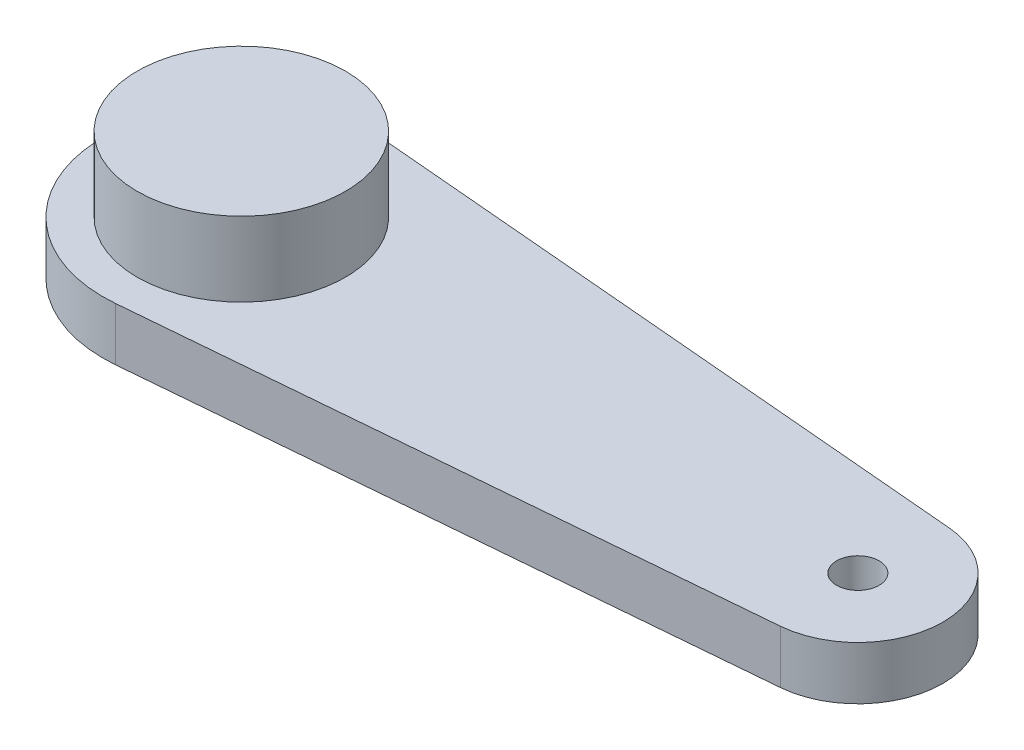
ISO-10303-21;
HEADER;
FILE_DESCRIPTION(('STEP AP214'),'2;1');
FILE_NAME('part.step','',(''),(''),'','','');
FILE_SCHEMA(('AUTOMOTIVE_DESIGN { 1 0 10303 214 1 1 1 1 }'));
ENDSEC;
DATA;
#1=APPLICATION_CONTEXT('core data for automotive mechanical design processes');
#2=APPLICATION_PROTOCOL_DEFINITION('international standard','automotive_design',2000,#1);
#3=PRODUCT_CONTEXT('',#1,'mechanical');
#4=PRODUCT('Part','Part','',(#3));
#5=PRODUCT_RELATED_PRODUCT_CATEGORY('part','',(#4));
#6=PRODUCT_DEFINITION_FORMATION('','',#4);
#7=PRODUCT_DEFINITION_CONTEXT('part definition',#1,'design');
#8=PRODUCT_DEFINITION('design','',#6,#7);
#9=PRODUCT_DEFINITION_SHAPE('','',#8);
#10=(LENGTH_UNIT() NAMED_UNIT(*) SI_UNIT(.MILLI.,.METRE.));
#11=(NAMED_UNIT(*) PLANE_ANGLE_UNIT() SI_UNIT($,.RADIAN.));
#12=(NAMED_UNIT(*) SI_UNIT($,.STERADIAN.) SOLID_ANGLE_UNIT());
#13=UNCERTAINTY_MEASURE_WITH_UNIT(LENGTH_MEASURE(1.E-05),#10,'distance_accuracy_value','');
#14=(GEOMETRIC_REPRESENTATION_CONTEXT(3) GLOBAL_UNCERTAINTY_ASSIGNED_CONTEXT((#13)) GLOBAL_UNIT_ASSIGNED_CONTEXT((#10,
#11,#12)) REPRESENTATION_CONTEXT('',''));
#15=CARTESIAN_POINT('',(0.,0.,0.));
#16=DIRECTION('',(0.,0.,1.));
#17=DIRECTION('',(1.,0.,0.));
#18=AXIS2_PLACEMENT_3D('',#15,#16,#17);
#19=CARTESIAN_POINT('',(0.,2.5,0.));
#20=DIRECTION('',(0.,1.,0.));
#21=DIRECTION('',(0.,0.,1.));
#22=AXIS2_PLACEMENT_3D('',#19,#20,#21);
#23=PLANE('',#22);
#24=CARTESIAN_POINT('',(0.,2.5,0.));
#25=DIRECTION('',(0.,1.,0.));
#26=DIRECTION('',(0.,0.,1.));
#27=AXIS2_PLACEMENT_3D('',#24,#25,#26);
#28=CIRCLE('',#27,4.9);
#29=CARTESIAN_POINT('',(0.,2.5,4.9));
#30=VERTEX_POINT('',#29);
#31=EDGE_CURVE('E11',#30,#30,#28,.T.);
#32=ORIENTED_EDGE('',*,*,#31,.F.);
#33=EDGE_LOOP('',(#32));
#34=FACE_BOUND('',#33,.T.);
#35=CARTESIAN_POINT('',(0.,2.5,0.));
#36=DIRECTION('',(0.,1.,0.));
#37=DIRECTION('',(0.,0.,1.));
#38=AXIS2_PLACEMENT_3D('',#35,#36,#37);
#39=CIRCLE('',#38,6.5);
#40=CARTESIAN_POINT('',(0.560344827586206,2.5,-6.47580216453509));
#41=VERTEX_POINT('',#40);
#42=CARTESIAN_POINT('',(0.560344827586207,2.5,6.47580216453509));
#43=VERTEX_POINT('',#42);
#44=EDGE_CURVE('E91',#41,#43,#39,.T.);
#45=ORIENTED_EDGE('',*,*,#44,.T.);
#46=DIRECTION('',(0.996277256082322,0.,-0.0862068965517241));
#47=VECTOR('',#46,1.);
#48=CARTESIAN_POINT('',(0.560344827586207,2.5,6.47580216453509));
#49=LINE('',#48,#47);
#50=CARTESIAN_POINT('',(29.3448275862069,2.5,3.98510902432929));
#51=VERTEX_POINT('',#50);
#52=EDGE_CURVE('E86',#43,#51,#49,.T.);
#53=ORIENTED_EDGE('',*,*,#52,.T.);
#54=CARTESIAN_POINT('',(29.,2.5,0.));
#55=DIRECTION('',(0.,1.,0.));
#56=DIRECTION('',(0.,0.,1.));
#57=AXIS2_PLACEMENT_3D('',#54,#55,#56);
#58=CIRCLE('',#57,4.);
#59=CARTESIAN_POINT('',(29.3448275862069,2.5,-3.98510902432929));
#60=VERTEX_POINT('',#59);
#61=EDGE_CURVE('E89',#51,#60,#58,.T.);
#62=ORIENTED_EDGE('',*,*,#61,.T.);
#63=DIRECTION('',(-0.996277256082322,0.,-0.086206896551724));
#64=VECTOR('',#63,1.);
#65=CARTESIAN_POINT('',(0.560344827586206,2.5,-6.47580216453509));
#66=LINE('',#65,#64);
#67=EDGE_CURVE('E55',#60,#41,#66,.T.);
#68=ORIENTED_EDGE('',*,*,#67,.T.);
#69=EDGE_LOOP('',(#45,#53,#62,#68));
#70=FACE_BOUND('',#69,.T.);
#71=CARTESIAN_POINT('',(29.,2.5,0.));
#72=DIRECTION('',(0.,1.,0.));
#73=DIRECTION('',(0.,0.,1.));
#74=AXIS2_PLACEMENT_3D('',#71,#72,#73);
#75=CIRCLE('',#74,1.);
#76=CARTESIAN_POINT('',(29.,2.5,1.));
#77=VERTEX_POINT('',#76);
#78=EDGE_CURVE('E107',#77,#77,#75,.T.);
#79=ORIENTED_EDGE('',*,*,#78,.F.);
#80=EDGE_LOOP('',(#79));
#81=FACE_BOUND('',#80,.T.);
#82=ADVANCED_FACE('F37',(#34,#70,#81),#23,.T.);
#83=CARTESIAN_POINT('',(0.,0.,0.));
#84=DIRECTION('',(0.,1.,0.));
#85=DIRECTION('',(0.,0.,1.));
#86=AXIS2_PLACEMENT_3D('',#83,#84,#85);
#87=PLANE('',#86);
#88=CARTESIAN_POINT('',(0.,0.,0.));
#89=DIRECTION('',(0.,1.,0.));
#90=DIRECTION('',(0.,0.,1.));
#91=AXIS2_PLACEMENT_3D('',#88,#89,#90);
#92=CIRCLE('',#91,6.5);
#93=CARTESIAN_POINT('',(0.560344827586206,0.,-6.47580216453509));
#94=VERTEX_POINT('',#93);
#95=CARTESIAN_POINT('',(0.560344827586207,0.,6.47580216453509));
#96=VERTEX_POINT('',#95);
#97=EDGE_CURVE('E104',#94,#96,#92,.T.);
#98=ORIENTED_EDGE('',*,*,#97,.F.);
#99=DIRECTION('',(-0.996277256082322,0.,-0.086206896551724));
#100=VECTOR('',#99,1.);
#101=CARTESIAN_POINT('',(0.560344827586206,0.,-6.47580216453509));
#102=LINE('',#101,#100);
#103=CARTESIAN_POINT('',(29.3448275862069,0.,-3.98510902432929));
#104=VERTEX_POINT('',#103);
#105=EDGE_CURVE('E78',#104,#94,#102,.T.);
#106=ORIENTED_EDGE('',*,*,#105,.F.);
#107=CARTESIAN_POINT('',(29.,0.,0.));
#108=DIRECTION('',(0.,1.,0.));
#109=DIRECTION('',(0.,0.,1.));
#110=AXIS2_PLACEMENT_3D('',#107,#108,#109);
#111=CIRCLE('',#110,4.);
#112=CARTESIAN_POINT('',(29.3448275862069,0.,3.98510902432929));
#113=VERTEX_POINT('',#112);
#114=EDGE_CURVE('E72',#113,#104,#111,.T.);
#115=ORIENTED_EDGE('',*,*,#114,.F.);
#116=DIRECTION('',(0.996277256082322,0.,-0.0862068965517241));
#117=VECTOR('',#116,1.);
#118=CARTESIAN_POINT('',(0.560344827586207,0.,6.47580216453509));
#119=LINE('',#118,#117);
#120=EDGE_CURVE('E96',#96,#113,#119,.T.);
#121=ORIENTED_EDGE('',*,*,#120,.F.);
#122=EDGE_LOOP('',(#98,#106,#115,#121));
#123=FACE_BOUND('',#122,.T.);
#124=CARTESIAN_POINT('',(29.,0.,0.));
#125=DIRECTION('',(0.,1.,0.));
#126=DIRECTION('',(0.,0.,1.));
#127=AXIS2_PLACEMENT_3D('',#124,#125,#126);
#128=CIRCLE('',#127,1.);
#129=CARTESIAN_POINT('',(29.,0.,1.));
#130=VERTEX_POINT('',#129);
#131=EDGE_CURVE('E119',#130,#130,#128,.T.);
#132=ORIENTED_EDGE('',*,*,#131,.T.);
#133=EDGE_LOOP('',(#132));
#134=FACE_BOUND('',#133,.T.);
#135=ADVANCED_FACE('F115',(#123,#134),#87,.F.);
#136=CARTESIAN_POINT('',(0.,2.5,0.));
#137=DIRECTION('',(0.,-1.,0.));
#138=DIRECTION('',(0.,0.,-1.));
#139=AXIS2_PLACEMENT_3D('',#136,#137,#138);
#140=CYLINDRICAL_SURFACE('',#139,6.5);
#141=ORIENTED_EDGE('',*,*,#97,.T.);
#142=DIRECTION('',(0.,-1.,0.));
#143=VECTOR('',#142,1.);
#144=CARTESIAN_POINT('',(0.560344827586207,2.5,6.47580216453509));
#145=LINE('',#144,#143);
#146=EDGE_CURVE('E41',#43,#96,#145,.T.);
#147=ORIENTED_EDGE('',*,*,#146,.F.);
#148=ORIENTED_EDGE('',*,*,#44,.F.);
#149=DIRECTION('',(0.,-1.,0.));
#150=VECTOR('',#149,1.);
#151=CARTESIAN_POINT('',(0.560344827586206,2.5,-6.47580216453509));
#152=LINE('',#151,#150);
#153=EDGE_CURVE('E100',#41,#94,#152,.T.);
#154=ORIENTED_EDGE('',*,*,#153,.T.);
#155=EDGE_LOOP('',(#141,#147,#148,#154));
#156=FACE_BOUND('',#155,.T.);
#157=ADVANCED_FACE('F39',(#156),#140,.T.);
#158=CARTESIAN_POINT('',(0.560344827586207,2.5,6.47580216453509));
#159=DIRECTION('',(-0.0862068965517241,0.,-0.996277256082322));
#160=DIRECTION('',(-0.996277256082322,0.,0.0862068965517241));
#161=AXIS2_PLACEMENT_3D('',#158,#159,#160);
#162=PLANE('',#161);
#163=ORIENTED_EDGE('',*,*,#120,.T.);
#164=DIRECTION('',(0.,-1.,0.));
#165=VECTOR('',#164,1.);
#166=CARTESIAN_POINT('',(29.3448275862069,2.5,3.98510902432929));
#167=LINE('',#166,#165);
#168=EDGE_CURVE('E94',#51,#113,#167,.T.);
#169=ORIENTED_EDGE('',*,*,#168,.F.);
#170=ORIENTED_EDGE('',*,*,#52,.F.);
#171=ORIENTED_EDGE('',*,*,#146,.T.);
#172=EDGE_LOOP('',(#163,#169,#170,#171));
#173=FACE_BOUND('',#172,.T.);
#174=ADVANCED_FACE('F95',(#173),#162,.F.);
#175=CARTESIAN_POINT('',(29.,2.5,0.));
#176=DIRECTION('',(0.,-1.,0.));
#177=DIRECTION('',(0.,0.,-1.));
#178=AXIS2_PLACEMENT_3D('',#175,#176,#177);
#179=CYLINDRICAL_SURFACE('',#178,4.);
#180=ORIENTED_EDGE('',*,*,#114,.T.);
#181=DIRECTION('',(0.,-1.,0.));
#182=VECTOR('',#181,1.);
#183=CARTESIAN_POINT('',(29.3448275862069,2.5,-3.98510902432929));
#184=LINE('',#183,#182);
#185=EDGE_CURVE('E97',#60,#104,#184,.T.);
#186=ORIENTED_EDGE('',*,*,#185,.F.);
#187=ORIENTED_EDGE('',*,*,#61,.F.);
#188=ORIENTED_EDGE('',*,*,#168,.T.);
#189=EDGE_LOOP('',(#180,#186,#187,#188));
#190=FACE_BOUND('',#189,.T.);
#191=ADVANCED_FACE('F98',(#190),#179,.T.);
#192=CARTESIAN_POINT('',(0.560344827586206,2.5,-6.47580216453509));
#193=DIRECTION('',(-0.086206896551724,0.,0.996277256082322));
#194=DIRECTION('',(0.996277256082322,0.,0.086206896551724));
#195=AXIS2_PLACEMENT_3D('',#192,#193,#194);
#196=PLANE('',#195);
#197=ORIENTED_EDGE('',*,*,#105,.T.);
#198=ORIENTED_EDGE('',*,*,#153,.F.);
#199=ORIENTED_EDGE('',*,*,#67,.F.);
#200=ORIENTED_EDGE('',*,*,#185,.T.);
#201=EDGE_LOOP('',(#197,#198,#199,#200));
#202=FACE_BOUND('',#201,.T.);
#203=ADVANCED_FACE('F112',(#202),#196,.F.);
#204=CARTESIAN_POINT('',(29.,2.5,0.));
#205=DIRECTION('',(0.,-1.,0.));
#206=DIRECTION('',(0.,0.,-1.));
#207=AXIS2_PLACEMENT_3D('',#204,#205,#206);
#208=CYLINDRICAL_SURFACE('',#207,1.);
#209=ORIENTED_EDGE('',*,*,#78,.T.);
#210=EDGE_LOOP('',(#209));
#211=FACE_BOUND('',#210,.T.);
#212=ORIENTED_EDGE('',*,*,#131,.F.);
#213=EDGE_LOOP('',(#212));
#214=FACE_BOUND('',#213,.T.);
#215=ADVANCED_FACE('F133',(#211,#214),#208,.F.);
#216=CARTESIAN_POINT('',(0.,6.,0.));
#217=DIRECTION('',(0.,-1.,0.));
#218=DIRECTION('',(0.,0.,-1.));
#219=AXIS2_PLACEMENT_3D('',#216,#217,#218);
#220=CYLINDRICAL_SURFACE('',#219,4.9);
#221=CARTESIAN_POINT('',(0.,6.,0.));
#222=DIRECTION('',(0.,1.,0.));
#223=DIRECTION('',(0.,0.,1.));
#224=AXIS2_PLACEMENT_3D('',#221,#222,#223);
#225=CIRCLE('',#224,4.9);
#226=CARTESIAN_POINT('',(0.,6.,4.9));
#227=VERTEX_POINT('',#226);
#228=EDGE_CURVE('E122',#227,#227,#225,.T.);
#229=ORIENTED_EDGE('',*,*,#228,.F.);
#230=EDGE_LOOP('',(#229));
#231=FACE_BOUND('',#230,.T.);
#232=ORIENTED_EDGE('',*,*,#31,.T.);
#233=EDGE_LOOP('',(#232));
#234=FACE_BOUND('',#233,.T.);
#235=ADVANCED_FACE('F130',(#231,#234),#220,.T.);
#236=CARTESIAN_POINT('',(0.,6.,0.));
#237=DIRECTION('',(0.,1.,0.));
#238=DIRECTION('',(0.,0.,1.));
#239=AXIS2_PLACEMENT_3D('',#236,#237,#238);
#240=PLANE('',#239);
#241=ORIENTED_EDGE('',*,*,#228,.T.);
#242=EDGE_LOOP('',(#241));
#243=FACE_BOUND('',#242,.T.);
#244=ADVANCED_FACE('F128',(#243),#240,.T.);
#245=CLOSED_SHELL('',(#82,#135,#157,#174,#191,#203,#215,#235,#244));
#246=MANIFOLD_SOLID_BREP('B2',#245);
#247=ADVANCED_BREP_SHAPE_REPRESENTATION('',(#18,#246),#14);
#248=SHAPE_DEFINITION_REPRESENTATION(#9,#247);
ENDSEC;
END-ISO-10303-21;
